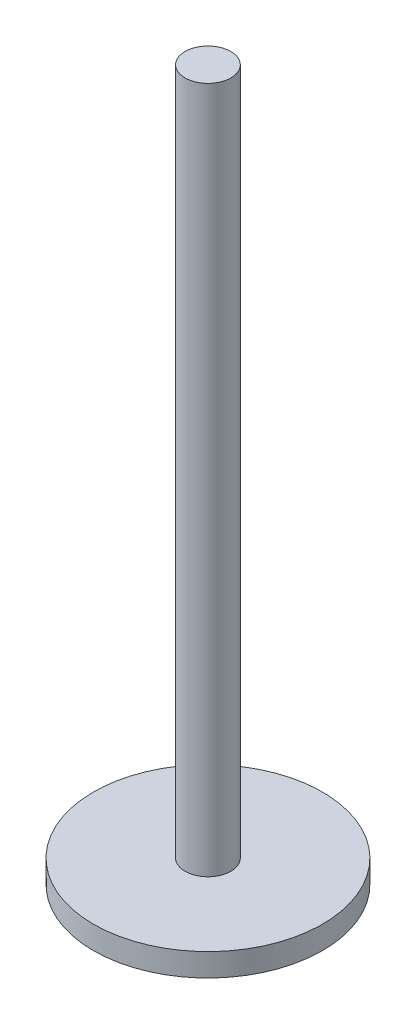
ISO-10303-21;
HEADER;
FILE_DESCRIPTION(('STEP AP214'),'2;1');
FILE_NAME('part.step','',(''),(''),'','','');
FILE_SCHEMA(('AUTOMOTIVE_DESIGN { 1 0 10303 214 1 1 1 1 }'));
ENDSEC;
DATA;
#1=APPLICATION_CONTEXT('core data for automotive mechanical design processes');
#2=APPLICATION_PROTOCOL_DEFINITION('international standard','automotive_design',2000,#1);
#3=PRODUCT_CONTEXT('',#1,'mechanical');
#4=PRODUCT('Part','Part','',(#3));
#5=PRODUCT_RELATED_PRODUCT_CATEGORY('part','',(#4));
#6=PRODUCT_DEFINITION_FORMATION('','',#4);
#7=PRODUCT_DEFINITION_CONTEXT('part definition',#1,'design');
#8=PRODUCT_DEFINITION('design','',#6,#7);
#9=PRODUCT_DEFINITION_SHAPE('','',#8);
#10=(LENGTH_UNIT() NAMED_UNIT(*) SI_UNIT(.MILLI.,.METRE.));
#11=(NAMED_UNIT(*) PLANE_ANGLE_UNIT() SI_UNIT($,.RADIAN.));
#12=(NAMED_UNIT(*) SI_UNIT($,.STERADIAN.) SOLID_ANGLE_UNIT());
#13=UNCERTAINTY_MEASURE_WITH_UNIT(LENGTH_MEASURE(1.E-05),#10,'distance_accuracy_value','');
#14=(GEOMETRIC_REPRESENTATION_CONTEXT(3) GLOBAL_UNCERTAINTY_ASSIGNED_CONTEXT((#13)) GLOBAL_UNIT_ASSIGNED_CONTEXT((#10,
#11,#12)) REPRESENTATION_CONTEXT('',''));
#15=CARTESIAN_POINT('',(0.,0.,0.));
#16=DIRECTION('',(0.,0.,1.));
#17=DIRECTION('',(1.,0.,0.));
#18=AXIS2_PLACEMENT_3D('',#15,#16,#17);
#19=CARTESIAN_POINT('',(0.,-0.4,0.));
#20=DIRECTION('',(0.,1.,0.));
#21=DIRECTION('',(0.,0.,1.));
#22=AXIS2_PLACEMENT_3D('',#19,#20,#21);
#23=CYLINDRICAL_SURFACE('',#22,2.);
#24=CARTESIAN_POINT('',(0.,-0.4,0.));
#25=DIRECTION('',(0.,1.,0.));
#26=DIRECTION('',(0.,0.,1.));
#27=AXIS2_PLACEMENT_3D('',#24,#25,#26);
#28=CIRCLE('',#27,2.);
#29=CARTESIAN_POINT('',(0.,-0.4,2.));
#30=VERTEX_POINT('',#29);
#31=EDGE_CURVE('E48',#30,#30,#28,.T.);
#32=ORIENTED_EDGE('',*,*,#31,.T.);
#33=EDGE_LOOP('',(#32));
#34=FACE_BOUND('',#33,.T.);
#35=CARTESIAN_POINT('',(0.,0.,0.));
#36=DIRECTION('',(0.,1.,0.));
#37=DIRECTION('',(0.,0.,1.));
#38=AXIS2_PLACEMENT_3D('',#35,#36,#37);
#39=CIRCLE('',#38,2.);
#40=CARTESIAN_POINT('',(0.,0.,2.));
#41=VERTEX_POINT('',#40);
#42=EDGE_CURVE('E44',#41,#41,#39,.T.);
#43=ORIENTED_EDGE('',*,*,#42,.F.);
#44=EDGE_LOOP('',(#43));
#45=FACE_BOUND('',#44,.T.);
#46=ADVANCED_FACE('F41',(#34,#45),#23,.T.);
#47=CARTESIAN_POINT('',(0.,-0.4,0.));
#48=DIRECTION('',(0.,1.,0.));
#49=DIRECTION('',(0.,0.,1.));
#50=AXIS2_PLACEMENT_3D('',#47,#48,#49);
#51=PLANE('',#50);
#52=ORIENTED_EDGE('',*,*,#31,.F.);
#53=EDGE_LOOP('',(#52));
#54=FACE_BOUND('',#53,.T.);
#55=ADVANCED_FACE('F66',(#54),#51,.F.);
#56=CARTESIAN_POINT('',(0.,0.,0.));
#57=DIRECTION('',(0.,1.,0.));
#58=DIRECTION('',(0.,0.,1.));
#59=AXIS2_PLACEMENT_3D('',#56,#57,#58);
#60=PLANE('',#59);
#61=CARTESIAN_POINT('',(0.,0.,0.));
#62=DIRECTION('',(0.,1.,0.));
#63=DIRECTION('',(0.,0.,1.));
#64=AXIS2_PLACEMENT_3D('',#61,#62,#63);
#65=CIRCLE('',#64,0.4);
#66=CARTESIAN_POINT('',(0.,0.,0.4));
#67=VERTEX_POINT('',#66);
#68=EDGE_CURVE('E10',#67,#67,#65,.T.);
#69=ORIENTED_EDGE('',*,*,#68,.F.);
#70=EDGE_LOOP('',(#69));
#71=FACE_BOUND('',#70,.T.);
#72=ORIENTED_EDGE('',*,*,#42,.T.);
#73=EDGE_LOOP('',(#72));
#74=FACE_BOUND('',#73,.T.);
#75=ADVANCED_FACE('F63',(#71,#74),#60,.T.);
#76=CARTESIAN_POINT('',(0.,12.,0.));
#77=DIRECTION('',(0.,-1.,0.));
#78=DIRECTION('',(0.,0.,-1.));
#79=AXIS2_PLACEMENT_3D('',#76,#77,#78);
#80=CYLINDRICAL_SURFACE('',#79,0.4);
#81=CARTESIAN_POINT('',(0.,12.,0.));
#82=DIRECTION('',(0.,1.,0.));
#83=DIRECTION('',(0.,0.,1.));
#84=AXIS2_PLACEMENT_3D('',#81,#82,#83);
#85=CIRCLE('',#84,0.4);
#86=CARTESIAN_POINT('',(0.,12.,0.4));
#87=VERTEX_POINT('',#86);
#88=EDGE_CURVE('E55',#87,#87,#85,.T.);
#89=ORIENTED_EDGE('',*,*,#88,.F.);
#90=EDGE_LOOP('',(#89));
#91=FACE_BOUND('',#90,.T.);
#92=ORIENTED_EDGE('',*,*,#68,.T.);
#93=EDGE_LOOP('',(#92));
#94=FACE_BOUND('',#93,.T.);
#95=ADVANCED_FACE('F77',(#91,#94),#80,.T.);
#96=CARTESIAN_POINT('',(0.,12.,0.));
#97=DIRECTION('',(0.,1.,0.));
#98=DIRECTION('',(0.,0.,1.));
#99=AXIS2_PLACEMENT_3D('',#96,#97,#98);
#100=PLANE('',#99);
#101=ORIENTED_EDGE('',*,*,#88,.T.);
#102=EDGE_LOOP('',(#101));
#103=FACE_BOUND('',#102,.T.);
#104=ADVANCED_FACE('F82',(#103),#100,.T.);
#105=CLOSED_SHELL('',(#46,#55,#75,#95,#104));
#106=MANIFOLD_SOLID_BREP('B2',#105);
#107=ADVANCED_BREP_SHAPE_REPRESENTATION('',(#18,#106),#14);
#108=SHAPE_DEFINITION_REPRESENTATION(#9,#107);
ENDSEC;
END-ISO-10303-21;
